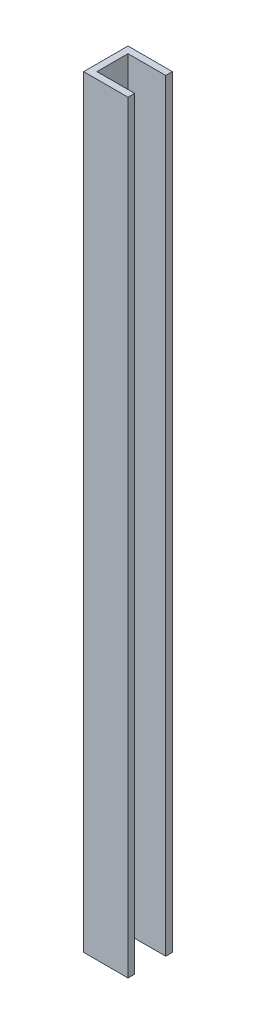
ISO-10303-21;
HEADER;
FILE_DESCRIPTION(('STEP AP214'),'2;1');
FILE_NAME('part.step','',(''),(''),'','','');
FILE_SCHEMA(('AUTOMOTIVE_DESIGN { 1 0 10303 214 1 1 1 1 }'));
ENDSEC;
DATA;
#1=APPLICATION_CONTEXT('core data for automotive mechanical design processes');
#2=APPLICATION_PROTOCOL_DEFINITION('international standard','automotive_design',2000,#1);
#3=PRODUCT_CONTEXT('',#1,'mechanical');
#4=PRODUCT('Part','Part','',(#3));
#5=PRODUCT_RELATED_PRODUCT_CATEGORY('part','',(#4));
#6=PRODUCT_DEFINITION_FORMATION('','',#4);
#7=PRODUCT_DEFINITION_CONTEXT('part definition',#1,'design');
#8=PRODUCT_DEFINITION('design','',#6,#7);
#9=PRODUCT_DEFINITION_SHAPE('','',#8);
#10=(LENGTH_UNIT() NAMED_UNIT(*) SI_UNIT(.MILLI.,.METRE.));
#11=(NAMED_UNIT(*) PLANE_ANGLE_UNIT() SI_UNIT($,.RADIAN.));
#12=(NAMED_UNIT(*) SI_UNIT($,.STERADIAN.) SOLID_ANGLE_UNIT());
#13=UNCERTAINTY_MEASURE_WITH_UNIT(LENGTH_MEASURE(1.E-05),#10,'distance_accuracy_value','');
#14=(GEOMETRIC_REPRESENTATION_CONTEXT(3) GLOBAL_UNCERTAINTY_ASSIGNED_CONTEXT((#13)) GLOBAL_UNIT_ASSIGNED_CONTEXT((#10,
#11,#12)) REPRESENTATION_CONTEXT('',''));
#15=CARTESIAN_POINT('',(0.,0.,0.));
#16=DIRECTION('',(0.,0.,1.));
#17=DIRECTION('',(1.,0.,0.));
#18=AXIS2_PLACEMENT_3D('',#15,#16,#17);
#19=CARTESIAN_POINT('',(-3.5,86.,0.));
#20=DIRECTION('',(1.,0.,0.));
#21=DIRECTION('',(0.,0.,-1.));
#22=AXIS2_PLACEMENT_3D('',#19,#20,#21);
#23=PLANE('',#22);
#24=DIRECTION('',(0.,0.,1.));
#25=VECTOR('',#24,1.);
#26=CARTESIAN_POINT('',(-3.5,-86.,0.));
#27=LINE('',#26,#25);
#28=CARTESIAN_POINT('',(-3.5,-86.,-3.50000000000002));
#29=VERTEX_POINT('',#28);
#30=CARTESIAN_POINT('',(-3.5,-86.,3.50000000000001));
#31=VERTEX_POINT('',#30);
#32=EDGE_CURVE('E197',#29,#31,#27,.T.);
#33=ORIENTED_EDGE('',*,*,#32,.F.);
#34=DIRECTION('',(0.,-1.,0.));
#35=VECTOR('',#34,1.);
#36=CARTESIAN_POINT('',(-3.5,86.,-3.50000000000002));
#37=LINE('',#36,#35);
#38=CARTESIAN_POINT('',(-3.5,86.,-3.50000000000002));
#39=VERTEX_POINT('',#38);
#40=EDGE_CURVE('E11',#39,#29,#37,.T.);
#41=ORIENTED_EDGE('',*,*,#40,.F.);
#42=DIRECTION('',(0.,0.,1.));
#43=VECTOR('',#42,1.);
#44=CARTESIAN_POINT('',(-3.5,86.,0.));
#45=LINE('',#44,#43);
#46=CARTESIAN_POINT('',(-3.5,86.,3.50000000000001));
#47=VERTEX_POINT('',#46);
#48=EDGE_CURVE('E153',#39,#47,#45,.T.);
#49=ORIENTED_EDGE('',*,*,#48,.T.);
#50=DIRECTION('',(0.,-1.,0.));
#51=VECTOR('',#50,1.);
#52=CARTESIAN_POINT('',(-3.5,86.,3.50000000000001));
#53=LINE('',#52,#51);
#54=EDGE_CURVE('E97',#47,#31,#53,.T.);
#55=ORIENTED_EDGE('',*,*,#54,.T.);
#56=EDGE_LOOP('',(#33,#41,#49,#55));
#57=FACE_BOUND('',#56,.T.);
#58=ADVANCED_FACE('F45',(#57),#23,.T.);
#59=CARTESIAN_POINT('',(0.,86.,-3.50000000000002));
#60=DIRECTION('',(0.,0.,1.));
#61=DIRECTION('',(1.,0.,0.));
#62=AXIS2_PLACEMENT_3D('',#59,#60,#61);
#63=PLANE('',#62);
#64=DIRECTION('',(-1.,0.,0.));
#65=VECTOR('',#64,1.);
#66=CARTESIAN_POINT('',(0.,-86.,-3.50000000000002));
#67=LINE('',#66,#65);
#68=CARTESIAN_POINT('',(5.,-86.,-3.50000000000002));
#69=VERTEX_POINT('',#68);
#70=EDGE_CURVE('E190',#69,#29,#67,.T.);
#71=ORIENTED_EDGE('',*,*,#70,.F.);
#72=DIRECTION('',(0.,-1.,0.));
#73=VECTOR('',#72,1.);
#74=CARTESIAN_POINT('',(5.,86.,-3.50000000000002));
#75=LINE('',#74,#73);
#76=CARTESIAN_POINT('',(5.,86.,-3.50000000000002));
#77=VERTEX_POINT('',#76);
#78=EDGE_CURVE('E54',#77,#69,#75,.T.);
#79=ORIENTED_EDGE('',*,*,#78,.F.);
#80=DIRECTION('',(-1.,0.,0.));
#81=VECTOR('',#80,1.);
#82=CARTESIAN_POINT('',(0.,86.,-3.50000000000002));
#83=LINE('',#82,#81);
#84=EDGE_CURVE('E145',#77,#39,#83,.T.);
#85=ORIENTED_EDGE('',*,*,#84,.T.);
#86=ORIENTED_EDGE('',*,*,#40,.T.);
#87=EDGE_LOOP('',(#71,#79,#85,#86));
#88=FACE_BOUND('',#87,.T.);
#89=ADVANCED_FACE('F195',(#88),#63,.T.);
#90=CARTESIAN_POINT('',(5.,86.,0.));
#91=DIRECTION('',(-1.,0.,0.));
#92=DIRECTION('',(0.,0.,1.));
#93=AXIS2_PLACEMENT_3D('',#90,#91,#92);
#94=PLANE('',#93);
#95=DIRECTION('',(0.,0.,-1.));
#96=VECTOR('',#95,1.);
#97=CARTESIAN_POINT('',(5.,-86.,0.));
#98=LINE('',#97,#96);
#99=CARTESIAN_POINT('',(5.,-86.,-5.00000000000002));
#100=VERTEX_POINT('',#99);
#101=EDGE_CURVE('E165',#69,#100,#98,.T.);
#102=ORIENTED_EDGE('',*,*,#101,.T.);
#103=DIRECTION('',(0.,-1.,0.));
#104=VECTOR('',#103,1.);
#105=CARTESIAN_POINT('',(5.,86.,-5.00000000000002));
#106=LINE('',#105,#104);
#107=CARTESIAN_POINT('',(5.,86.,-5.00000000000002));
#108=VERTEX_POINT('',#107);
#109=EDGE_CURVE('E178',#108,#100,#106,.T.);
#110=ORIENTED_EDGE('',*,*,#109,.F.);
#111=DIRECTION('',(0.,0.,-1.));
#112=VECTOR('',#111,1.);
#113=CARTESIAN_POINT('',(5.,86.,0.));
#114=LINE('',#113,#112);
#115=EDGE_CURVE('E138',#77,#108,#114,.T.);
#116=ORIENTED_EDGE('',*,*,#115,.F.);
#117=ORIENTED_EDGE('',*,*,#78,.T.);
#118=EDGE_LOOP('',(#102,#110,#116,#117));
#119=FACE_BOUND('',#118,.T.);
#120=ADVANCED_FACE('F184',(#119),#94,.F.);
#121=CARTESIAN_POINT('',(0.,86.,-5.00000000000002));
#122=DIRECTION('',(0.,0.,-1.));
#123=DIRECTION('',(-1.,0.,0.));
#124=AXIS2_PLACEMENT_3D('',#121,#122,#123);
#125=PLANE('',#124);
#126=DIRECTION('',(1.,0.,0.));
#127=VECTOR('',#126,1.);
#128=CARTESIAN_POINT('',(0.,-86.,-5.00000000000002));
#129=LINE('',#128,#127);
#130=CARTESIAN_POINT('',(-5.,-86.,-5.00000000000002));
#131=VERTEX_POINT('',#130);
#132=EDGE_CURVE('E193',#131,#100,#129,.T.);
#133=ORIENTED_EDGE('',*,*,#132,.F.);
#134=DIRECTION('',(0.,-1.,0.));
#135=VECTOR('',#134,1.);
#136=CARTESIAN_POINT('',(-5.,86.,-5.00000000000002));
#137=LINE('',#136,#135);
#138=CARTESIAN_POINT('',(-5.,86.,-5.00000000000002));
#139=VERTEX_POINT('',#138);
#140=EDGE_CURVE('E175',#139,#131,#137,.T.);
#141=ORIENTED_EDGE('',*,*,#140,.F.);
#142=DIRECTION('',(1.,0.,0.));
#143=VECTOR('',#142,1.);
#144=CARTESIAN_POINT('',(0.,86.,-5.00000000000002));
#145=LINE('',#144,#143);
#146=EDGE_CURVE('E144',#139,#108,#145,.T.);
#147=ORIENTED_EDGE('',*,*,#146,.T.);
#148=ORIENTED_EDGE('',*,*,#109,.T.);
#149=EDGE_LOOP('',(#133,#141,#147,#148));
#150=FACE_BOUND('',#149,.T.);
#151=ADVANCED_FACE('F210',(#150),#125,.T.);
#152=CARTESIAN_POINT('',(-5.,86.,0.));
#153=DIRECTION('',(-1.,0.,0.));
#154=DIRECTION('',(0.,0.,1.));
#155=AXIS2_PLACEMENT_3D('',#152,#153,#154);
#156=PLANE('',#155);
#157=DIRECTION('',(0.,0.,-1.));
#158=VECTOR('',#157,1.);
#159=CARTESIAN_POINT('',(-5.,-86.,0.));
#160=LINE('',#159,#158);
#161=CARTESIAN_POINT('',(-5.,-86.,5.00000000000002));
#162=VERTEX_POINT('',#161);
#163=EDGE_CURVE('E203',#162,#131,#160,.T.);
#164=ORIENTED_EDGE('',*,*,#163,.F.);
#165=DIRECTION('',(0.,-1.,0.));
#166=VECTOR('',#165,1.);
#167=CARTESIAN_POINT('',(-5.,86.,5.00000000000002));
#168=LINE('',#167,#166);
#169=CARTESIAN_POINT('',(-5.,86.,5.00000000000002));
#170=VERTEX_POINT('',#169);
#171=EDGE_CURVE('E132',#170,#162,#168,.T.);
#172=ORIENTED_EDGE('',*,*,#171,.F.);
#173=DIRECTION('',(0.,0.,-1.));
#174=VECTOR('',#173,1.);
#175=CARTESIAN_POINT('',(-5.,86.,0.));
#176=LINE('',#175,#174);
#177=EDGE_CURVE('E123',#170,#139,#176,.T.);
#178=ORIENTED_EDGE('',*,*,#177,.T.);
#179=ORIENTED_EDGE('',*,*,#140,.T.);
#180=EDGE_LOOP('',(#164,#172,#178,#179));
#181=FACE_BOUND('',#180,.T.);
#182=ADVANCED_FACE('F208',(#181),#156,.T.);
#183=CARTESIAN_POINT('',(0.,86.,5.00000000000002));
#184=DIRECTION('',(0.,0.,-1.));
#185=DIRECTION('',(-1.,0.,0.));
#186=AXIS2_PLACEMENT_3D('',#183,#184,#185);
#187=PLANE('',#186);
#188=DIRECTION('',(1.,0.,0.));
#189=VECTOR('',#188,1.);
#190=CARTESIAN_POINT('',(0.,-86.,5.00000000000002));
#191=LINE('',#190,#189);
#192=CARTESIAN_POINT('',(5.,-86.,5.00000000000002));
#193=VERTEX_POINT('',#192);
#194=EDGE_CURVE('E130',#162,#193,#191,.T.);
#195=ORIENTED_EDGE('',*,*,#194,.T.);
#196=DIRECTION('',(0.,-1.,0.));
#197=VECTOR('',#196,1.);
#198=CARTESIAN_POINT('',(5.,86.,5.00000000000002));
#199=LINE('',#198,#197);
#200=CARTESIAN_POINT('',(5.,86.,5.00000000000002));
#201=VERTEX_POINT('',#200);
#202=EDGE_CURVE('E127',#201,#193,#199,.T.);
#203=ORIENTED_EDGE('',*,*,#202,.F.);
#204=DIRECTION('',(1.,0.,0.));
#205=VECTOR('',#204,1.);
#206=CARTESIAN_POINT('',(0.,86.,5.00000000000002));
#207=LINE('',#206,#205);
#208=EDGE_CURVE('E116',#170,#201,#207,.T.);
#209=ORIENTED_EDGE('',*,*,#208,.F.);
#210=ORIENTED_EDGE('',*,*,#171,.T.);
#211=EDGE_LOOP('',(#195,#203,#209,#210));
#212=FACE_BOUND('',#211,.T.);
#213=ADVANCED_FACE('F128',(#212),#187,.F.);
#214=CARTESIAN_POINT('',(5.,-86.,3.50000000000001));
#215=VERTEX_POINT('',#214);
#216=EDGE_CURVE('E90',#193,#215,#98,.T.);
#217=ORIENTED_EDGE('',*,*,#216,.T.);
#218=DIRECTION('',(0.,-1.,0.));
#219=VECTOR('',#218,1.);
#220=CARTESIAN_POINT('',(5.,86.,3.50000000000001));
#221=LINE('',#220,#219);
#222=CARTESIAN_POINT('',(5.,86.,3.50000000000001));
#223=VERTEX_POINT('',#222);
#224=EDGE_CURVE('E133',#223,#215,#221,.T.);
#225=ORIENTED_EDGE('',*,*,#224,.F.);
#226=EDGE_CURVE('E120',#201,#223,#114,.T.);
#227=ORIENTED_EDGE('',*,*,#226,.F.);
#228=ORIENTED_EDGE('',*,*,#202,.T.);
#229=EDGE_LOOP('',(#217,#225,#227,#228));
#230=FACE_BOUND('',#229,.T.);
#231=ADVANCED_FACE('F135',(#230),#94,.F.);
#232=CARTESIAN_POINT('',(0.,86.,3.50000000000001));
#233=DIRECTION('',(0.,0.,1.));
#234=DIRECTION('',(1.,0.,0.));
#235=AXIS2_PLACEMENT_3D('',#232,#233,#234);
#236=PLANE('',#235);
#237=DIRECTION('',(-1.,0.,0.));
#238=VECTOR('',#237,1.);
#239=CARTESIAN_POINT('',(0.,-86.,3.50000000000001));
#240=LINE('',#239,#238);
#241=EDGE_CURVE('E156',#215,#31,#240,.T.);
#242=ORIENTED_EDGE('',*,*,#241,.T.);
#243=ORIENTED_EDGE('',*,*,#54,.F.);
#244=DIRECTION('',(-1.,0.,0.));
#245=VECTOR('',#244,1.);
#246=CARTESIAN_POINT('',(0.,86.,3.50000000000001));
#247=LINE('',#246,#245);
#248=EDGE_CURVE('E62',#223,#47,#247,.T.);
#249=ORIENTED_EDGE('',*,*,#248,.F.);
#250=ORIENTED_EDGE('',*,*,#224,.T.);
#251=EDGE_LOOP('',(#242,#243,#249,#250));
#252=FACE_BOUND('',#251,.T.);
#253=ADVANCED_FACE('F260',(#252),#236,.F.);
#254=CARTESIAN_POINT('',(0.,86.,0.));
#255=DIRECTION('',(0.,1.,0.));
#256=DIRECTION('',(0.,0.,1.));
#257=AXIS2_PLACEMENT_3D('',#254,#255,#256);
#258=PLANE('',#257);
#259=ORIENTED_EDGE('',*,*,#48,.F.);
#260=ORIENTED_EDGE('',*,*,#84,.F.);
#261=ORIENTED_EDGE('',*,*,#115,.T.);
#262=ORIENTED_EDGE('',*,*,#146,.F.);
#263=ORIENTED_EDGE('',*,*,#177,.F.);
#264=ORIENTED_EDGE('',*,*,#208,.T.);
#265=ORIENTED_EDGE('',*,*,#226,.T.);
#266=ORIENTED_EDGE('',*,*,#248,.T.);
#267=EDGE_LOOP('',(#259,#260,#261,#262,#263,#264,#265,#266));
#268=FACE_BOUND('',#267,.T.);
#269=ADVANCED_FACE('F118',(#268),#258,.T.);
#270=CARTESIAN_POINT('',(0.,-86.,0.));
#271=DIRECTION('',(0.,1.,0.));
#272=DIRECTION('',(0.,0.,1.));
#273=AXIS2_PLACEMENT_3D('',#270,#271,#272);
#274=PLANE('',#273);
#275=ORIENTED_EDGE('',*,*,#32,.T.);
#276=ORIENTED_EDGE('',*,*,#241,.F.);
#277=ORIENTED_EDGE('',*,*,#216,.F.);
#278=ORIENTED_EDGE('',*,*,#194,.F.);
#279=ORIENTED_EDGE('',*,*,#163,.T.);
#280=ORIENTED_EDGE('',*,*,#132,.T.);
#281=ORIENTED_EDGE('',*,*,#101,.F.);
#282=ORIENTED_EDGE('',*,*,#70,.T.);
#283=EDGE_LOOP('',(#275,#276,#277,#278,#279,#280,#281,#282));
#284=FACE_BOUND('',#283,.T.);
#285=ADVANCED_FACE('F189',(#284),#274,.F.);
#286=CLOSED_SHELL('',(#58,#89,#120,#151,#182,#213,#231,#253,#269,#285));
#287=MANIFOLD_SOLID_BREP('B2',#286);
#288=ADVANCED_BREP_SHAPE_REPRESENTATION('',(#18,#287),#14);
#289=SHAPE_DEFINITION_REPRESENTATION(#9,#288);
ENDSEC;
END-ISO-10303-21;
